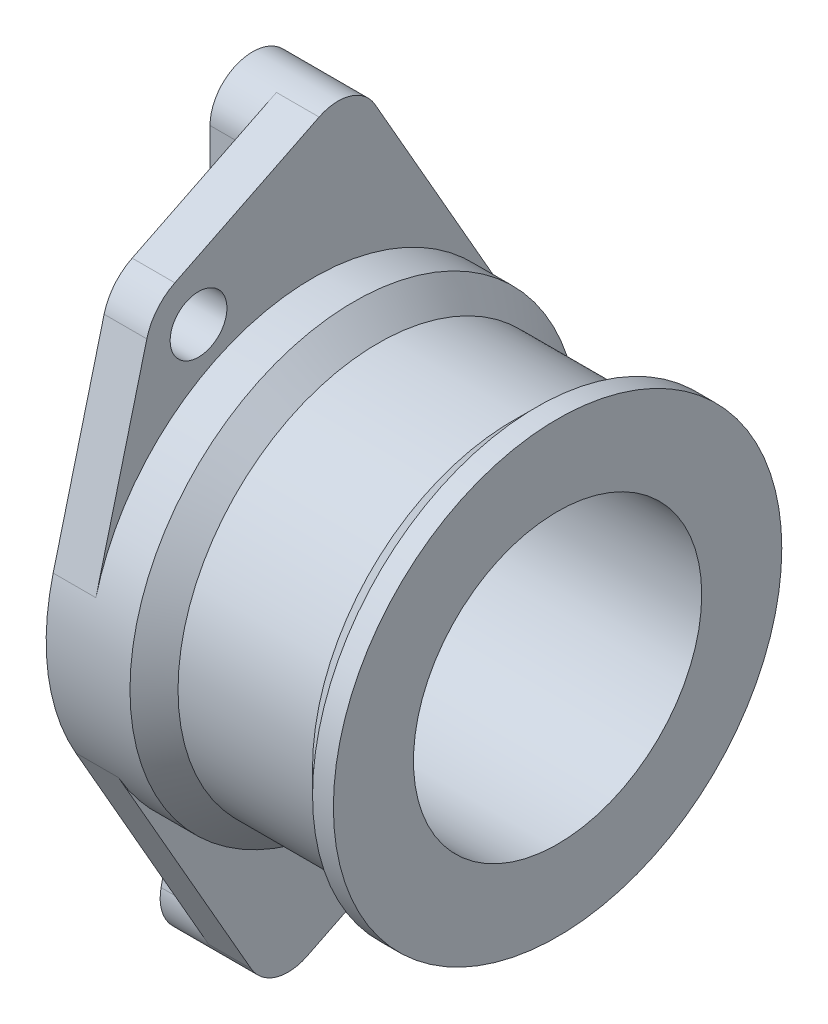
ISO-10303-21;
HEADER;
FILE_DESCRIPTION(('STEP AP214'),'2;1');
FILE_NAME('part.step','',(''),(''),'','','');
FILE_SCHEMA(('AUTOMOTIVE_DESIGN { 1 0 10303 214 1 1 1 1 }'));
ENDSEC;
DATA;
#1=APPLICATION_CONTEXT('core data for automotive mechanical design processes');
#2=APPLICATION_PROTOCOL_DEFINITION('international standard','automotive_design',2000,#1);
#3=PRODUCT_CONTEXT('',#1,'mechanical');
#4=PRODUCT('Part','Part','',(#3));
#5=PRODUCT_RELATED_PRODUCT_CATEGORY('part','',(#4));
#6=PRODUCT_DEFINITION_FORMATION('','',#4);
#7=PRODUCT_DEFINITION_CONTEXT('part definition',#1,'design');
#8=PRODUCT_DEFINITION('design','',#6,#7);
#9=PRODUCT_DEFINITION_SHAPE('','',#8);
#10=(LENGTH_UNIT() NAMED_UNIT(*) SI_UNIT(.MILLI.,.METRE.));
#11=(NAMED_UNIT(*) PLANE_ANGLE_UNIT() SI_UNIT($,.RADIAN.));
#12=(NAMED_UNIT(*) SI_UNIT($,.STERADIAN.) SOLID_ANGLE_UNIT());
#13=UNCERTAINTY_MEASURE_WITH_UNIT(LENGTH_MEASURE(1.E-05),#10,'distance_accuracy_value','');
#14=(GEOMETRIC_REPRESENTATION_CONTEXT(3) GLOBAL_UNCERTAINTY_ASSIGNED_CONTEXT((#13)) GLOBAL_UNIT_ASSIGNED_CONTEXT((#10,
#11,#12)) REPRESENTATION_CONTEXT('',''));
#15=CARTESIAN_POINT('',(0.,0.,0.));
#16=DIRECTION('',(0.,0.,1.));
#17=DIRECTION('',(1.,0.,0.));
#18=AXIS2_PLACEMENT_3D('',#15,#16,#17);
#19=CARTESIAN_POINT('',(-5.08,30.7076011087981,-2.1659998583497));
#20=DIRECTION('',(1.,0.,0.));
#21=DIRECTION('',(0.,0.,-1.));
#22=AXIS2_PLACEMENT_3D('',#19,#20,#21);
#23=CYLINDRICAL_SURFACE('',#22,4.2658017028528);
#24=CARTESIAN_POINT('',(0.,30.7076011087981,-2.1659998583497));
#25=DIRECTION('',(-1.,0.,0.));
#26=DIRECTION('',(0.,0.,-1.));
#27=AXIS2_PLACEMENT_3D('',#24,#25,#26);
#28=CIRCLE('',#27,4.2658017028528);
#29=CARTESIAN_POINT('',(0.,29.8206910640647,-6.33858355920134));
#30=VERTEX_POINT('',#29);
#31=CARTESIAN_POINT('',(0.,26.509400845553,-2.92242481679052));
#32=VERTEX_POINT('',#31);
#33=EDGE_CURVE('E230',#30,#32,#28,.T.);
#34=ORIENTED_EDGE('',*,*,#33,.T.);
#35=DIRECTION('',(-1.,0.,0.));
#36=VECTOR('',#35,1.);
#37=CARTESIAN_POINT('',(0.,26.509400845553,-2.92242481679052));
#38=LINE('',#37,#36);
#39=CARTESIAN_POINT('',(-5.08,26.509400845553,-2.92242481679052));
#40=VERTEX_POINT('',#39);
#41=EDGE_CURVE('E211',#32,#40,#38,.T.);
#42=ORIENTED_EDGE('',*,*,#41,.T.);
#43=CARTESIAN_POINT('',(-5.08,30.7076011087981,-2.1659998583497));
#44=DIRECTION('',(-1.,0.,0.));
#45=DIRECTION('',(0.,0.,-1.));
#46=AXIS2_PLACEMENT_3D('',#43,#44,#45);
#47=CIRCLE('',#46,4.2658017028528);
#48=CARTESIAN_POINT('',(-5.08,29.8206910640646,-6.33858355920149));
#49=VERTEX_POINT('',#48);
#50=EDGE_CURVE('E727',#49,#40,#47,.T.);
#51=ORIENTED_EDGE('',*,*,#50,.F.);
#52=DIRECTION('',(1.,0.,0.));
#53=VECTOR('',#52,1.);
#54=CARTESIAN_POINT('',(-5.08,29.8206910640646,-6.33858355920149));
#55=LINE('',#54,#53);
#56=EDGE_CURVE('E246',#49,#30,#55,.T.);
#57=ORIENTED_EDGE('',*,*,#56,.T.);
#58=EDGE_LOOP('',(#34,#42,#51,#57));
#59=FACE_BOUND('',#58,.T.);
#60=ADVANCED_FACE('F46',(#59),#23,.T.);
#61=CARTESIAN_POINT('',(-5.08,-30.7076011087981,2.1659998583497));
#62=DIRECTION('',(1.,0.,0.));
#63=DIRECTION('',(0.,0.,-1.));
#64=AXIS2_PLACEMENT_3D('',#61,#62,#63);
#65=CYLINDRICAL_SURFACE('',#64,4.2658017028527);
#66=CARTESIAN_POINT('',(0.,-30.7076011087981,2.1659998583497));
#67=DIRECTION('',(-1.,0.,0.));
#68=DIRECTION('',(0.,0.,-1.));
#69=AXIS2_PLACEMENT_3D('',#66,#67,#68);
#70=CIRCLE('',#69,4.2658017028527);
#71=CARTESIAN_POINT('',(0.,-29.8206910640647,6.33858355920129));
#72=VERTEX_POINT('',#71);
#73=CARTESIAN_POINT('',(0.,-26.509400845553,2.92242481679052));
#74=VERTEX_POINT('',#73);
#75=EDGE_CURVE('E273',#72,#74,#70,.T.);
#76=ORIENTED_EDGE('',*,*,#75,.T.);
#77=DIRECTION('',(-1.,0.,0.));
#78=VECTOR('',#77,1.);
#79=CARTESIAN_POINT('',(0.,-26.509400845553,2.92242481679052));
#80=LINE('',#79,#78);
#81=CARTESIAN_POINT('',(-5.08,-26.509400845553,2.92242481679052));
#82=VERTEX_POINT('',#81);
#83=EDGE_CURVE('E708',#74,#82,#80,.T.);
#84=ORIENTED_EDGE('',*,*,#83,.T.);
#85=CARTESIAN_POINT('',(-5.08,-30.7076011087981,2.1659998583497));
#86=DIRECTION('',(-1.,0.,0.));
#87=DIRECTION('',(0.,0.,-1.));
#88=AXIS2_PLACEMENT_3D('',#85,#86,#87);
#89=CIRCLE('',#88,4.2658017028527);
#90=CARTESIAN_POINT('',(-5.08,-29.8206910640647,6.33858355920129));
#91=VERTEX_POINT('',#90);
#92=EDGE_CURVE('E260',#91,#82,#89,.T.);
#93=ORIENTED_EDGE('',*,*,#92,.F.);
#94=DIRECTION('',(1.,0.,0.));
#95=VECTOR('',#94,1.);
#96=CARTESIAN_POINT('',(-5.08,-29.8206910640647,6.33858355920129));
#97=LINE('',#96,#95);
#98=EDGE_CURVE('E283',#91,#72,#97,.T.);
#99=ORIENTED_EDGE('',*,*,#98,.T.);
#100=EDGE_LOOP('',(#76,#84,#93,#99));
#101=FACE_BOUND('',#100,.T.);
#102=ADVANCED_FACE('F706',(#101),#65,.T.);
#103=CARTESIAN_POINT('',(0.,-38.3206980670754,2.96616859215303));
#104=DIRECTION('',(1.,0.,0.));
#105=DIRECTION('',(0.,0.,-1.));
#106=AXIS2_PLACEMENT_3D('',#103,#104,#105);
#107=PLANE('',#106);
#108=CARTESIAN_POINT('',(0.,0.,0.));
#109=DIRECTION('',(1.,0.,0.));
#110=DIRECTION('',(0.,0.,-1.));
#111=AXIS2_PLACEMENT_3D('',#108,#109,#110);
#112=CIRCLE('',#111,17.145);
#113=CARTESIAN_POINT('',(0.,0.,-17.145));
#114=VERTEX_POINT('',#113);
#115=EDGE_CURVE('E565',#114,#114,#112,.T.);
#116=ORIENTED_EDGE('',*,*,#115,.T.);
#117=EDGE_LOOP('',(#116));
#118=FACE_BOUND('',#117,.T.);
#119=CARTESIAN_POINT('',(0.,-28.6781594627474,-13.6244511753454));
#120=DIRECTION('',(-1.,0.,0.));
#121=DIRECTION('',(0.,0.,1.));
#122=AXIS2_PLACEMENT_3D('',#119,#120,#121);
#123=CIRCLE('',#122,3.37819999999999);
#124=CARTESIAN_POINT('',(0.,-28.6781594627474,-10.2462511753454));
#125=VERTEX_POINT('',#124);
#126=EDGE_CURVE('E661',#125,#125,#123,.T.);
#127=ORIENTED_EDGE('',*,*,#126,.F.);
#128=EDGE_LOOP('',(#127));
#129=FACE_BOUND('',#128,.T.);
#130=CARTESIAN_POINT('',(0.,28.6781594627474,13.6244511753454));
#131=DIRECTION('',(-1.,0.,0.));
#132=DIRECTION('',(0.,0.,1.));
#133=AXIS2_PLACEMENT_3D('',#130,#131,#132);
#134=CIRCLE('',#133,3.37819999999999);
#135=CARTESIAN_POINT('',(0.,28.6781594627474,17.0026511753454));
#136=VERTEX_POINT('',#135);
#137=EDGE_CURVE('E1211',#136,#136,#134,.T.);
#138=ORIENTED_EDGE('',*,*,#137,.F.);
#139=EDGE_LOOP('',(#138));
#140=FACE_BOUND('',#139,.T.);
#141=DIRECTION('',(0.,0.968668563940953,-0.248357027749513));
#142=VECTOR('',#141,1.);
#143=CARTESIAN_POINT('',(0.,33.0773129734172,19.0519415525357));
#144=LINE('',#143,#142);
#145=CARTESIAN_POINT('',(0.,6.62368193007954,25.8343906003052));
#146=VERTEX_POINT('',#145);
#147=CARTESIAN_POINT('',(0.,30.2552265889568,19.7754965563705));
#148=VERTEX_POINT('',#147);
#149=EDGE_CURVE('E314',#146,#148,#144,.T.);
#150=ORIENTED_EDGE('',*,*,#149,.T.);
#151=CARTESIAN_POINT('',(0.,28.6781594627474,13.6244511753454));
#152=DIRECTION('',(1.,0.,0.));
#153=DIRECTION('',(0.,0.,-1.));
#154=AXIS2_PLACEMENT_3D('',#151,#152,#153);
#155=CIRCLE('',#154,6.35);
#156=CARTESIAN_POINT('',(0.,34.3694442408475,16.4407923433444));
#157=VERTEX_POINT('',#156);
#158=EDGE_CURVE('E672',#148,#157,#155,.F.);
#159=ORIENTED_EDGE('',*,*,#158,.T.);
#160=DIRECTION('',(0.,0.443518294173067,-0.896265319385846));
#161=VECTOR('',#160,1.);
#162=CARTESIAN_POINT('',(0.,42.8611516784846,-0.719318025755982));
#163=LINE('',#162,#161);
#164=CARTESIAN_POINT('',(0.,42.8611516784845,-0.719318025756039));
#165=VERTEX_POINT('',#164);
#166=EDGE_CURVE('E316',#157,#165,#163,.T.);
#167=ORIENTED_EDGE('',*,*,#166,.T.);
#168=CARTESIAN_POINT('',(0.,38.3206980670754,-2.96616859215303));
#169=DIRECTION('',(-1.,0.,0.));
#170=DIRECTION('',(0.,0.,-1.));
#171=AXIS2_PLACEMENT_3D('',#168,#169,#170);
#172=CIRCLE('',#171,5.0659704366561);
#173=CARTESIAN_POINT('',(0.,38.3206980670755,2.09980184450316));
#174=VERTEX_POINT('',#173);
#175=EDGE_CURVE('E234',#174,#165,#172,.T.);
#176=ORIENTED_EDGE('',*,*,#175,.F.);
#177=DIRECTION('',(0.,1.,0.));
#178=VECTOR('',#177,1.);
#179=CARTESIAN_POINT('',(0.,38.3206980670754,2.09980184450316));
#180=LINE('',#179,#178);
#181=CARTESIAN_POINT('',(0.,30.7076011087981,2.09980184450296));
#182=VERTEX_POINT('',#181);
#183=EDGE_CURVE('E228',#182,#174,#180,.T.);
#184=ORIENTED_EDGE('',*,*,#183,.F.);
#185=CARTESIAN_POINT('',(0.,26.6571517005943,-0.827745861664103));
#186=VERTEX_POINT('',#185);
#187=EDGE_CURVE('E221',#186,#182,#28,.T.);
#188=ORIENTED_EDGE('',*,*,#187,.F.);
#189=CARTESIAN_POINT('',(0.,3.59434704222395E-12,-2.62702186393238E-13));
#190=DIRECTION('',(-1.,0.,0.));
#191=DIRECTION('',(0.,0.,1.));
#192=AXIS2_PLACEMENT_3D('',#189,#190,#191);
#193=CIRCLE('',#192,26.6699999999964);
#194=EDGE_CURVE('E205',#186,#32,#193,.T.);
#195=ORIENTED_EDGE('',*,*,#194,.T.);
#196=ORIENTED_EDGE('',*,*,#33,.F.);
#197=DIRECTION('',(0.,-0.978147600733805,0.20791169081776));
#198=VECTOR('',#197,1.);
#199=CARTESIAN_POINT('',(0.,29.8206910640646,-6.33858355920149));
#200=LINE('',#199,#198);
#201=CARTESIAN_POINT('',(0.,37.2674235879575,-7.92143542015649));
#202=VERTEX_POINT('',#201);
#203=EDGE_CURVE('E231',#202,#30,#200,.T.);
#204=ORIENTED_EDGE('',*,*,#203,.F.);
#205=CARTESIAN_POINT('',(0.,40.8363756208689,-7.36337485413513));
#206=VERTEX_POINT('',#205);
#207=EDGE_CURVE('E721',#206,#202,#172,.T.);
#208=ORIENTED_EDGE('',*,*,#207,.F.);
#209=DIRECTION('',(0.,-0.867988930642967,-0.496583544110433));
#210=VECTOR('',#209,1.);
#211=CARTESIAN_POINT('',(0.,13.2438831214252,-23.149264780248));
#212=LINE('',#211,#210);
#213=CARTESIAN_POINT('',(0.,13.2438831214252,-23.1492647802479));
#214=VERTEX_POINT('',#213);
#215=EDGE_CURVE('E318',#206,#214,#212,.T.);
#216=ORIENTED_EDGE('',*,*,#215,.T.);
#217=CARTESIAN_POINT('',(0.,0.,0.));
#218=DIRECTION('',(-1.,0.,0.));
#219=DIRECTION('',(0.,0.,-1.));
#220=AXIS2_PLACEMENT_3D('',#217,#218,#219);
#221=CIRCLE('',#220,26.67);
#222=CARTESIAN_POINT('',(0.,-6.62368193007954,-25.8343906003052));
#223=VERTEX_POINT('',#222);
#224=EDGE_CURVE('E321',#214,#223,#221,.T.);
#225=ORIENTED_EDGE('',*,*,#224,.T.);
#226=DIRECTION('',(0.,-0.968668563940953,0.248357027749513));
#227=VECTOR('',#226,1.);
#228=CARTESIAN_POINT('',(0.,-33.0773129734172,-19.0519415525357));
#229=LINE('',#228,#227);
#230=CARTESIAN_POINT('',(0.,-30.2552265889568,-19.7754965563705));
#231=VERTEX_POINT('',#230);
#232=EDGE_CURVE('E323',#223,#231,#229,.T.);
#233=ORIENTED_EDGE('',*,*,#232,.T.);
#234=CARTESIAN_POINT('',(0.,-28.6781594627474,-13.6244511753454));
#235=DIRECTION('',(1.,0.,0.));
#236=DIRECTION('',(0.,0.,-1.));
#237=AXIS2_PLACEMENT_3D('',#234,#235,#236);
#238=CIRCLE('',#237,6.35);
#239=CARTESIAN_POINT('',(0.,-34.3694442408475,-16.4407923433444));
#240=VERTEX_POINT('',#239);
#241=EDGE_CURVE('E670',#231,#240,#238,.F.);
#242=ORIENTED_EDGE('',*,*,#241,.T.);
#243=DIRECTION('',(0.,-0.443518294173067,0.896265319385846));
#244=VECTOR('',#243,1.);
#245=CARTESIAN_POINT('',(0.,-42.8611516784846,0.719318025755979));
#246=LINE('',#245,#244);
#247=CARTESIAN_POINT('',(0.,-42.8611516784846,0.719318025755979));
#248=VERTEX_POINT('',#247);
#249=EDGE_CURVE('E326',#240,#248,#246,.T.);
#250=ORIENTED_EDGE('',*,*,#249,.T.);
#251=CARTESIAN_POINT('',(0.,-38.3206980670754,2.96616859215303));
#252=DIRECTION('',(-1.,0.,0.));
#253=DIRECTION('',(0.,0.,-1.));
#254=AXIS2_PLACEMENT_3D('',#251,#252,#253);
#255=CIRCLE('',#254,5.0659704366561);
#256=CARTESIAN_POINT('',(0.,-38.3206980670754,-2.09980184450317));
#257=VERTEX_POINT('',#256);
#258=EDGE_CURVE('E252',#257,#248,#255,.T.);
#259=ORIENTED_EDGE('',*,*,#258,.F.);
#260=DIRECTION('',(0.,-1.,0.));
#261=VECTOR('',#260,1.);
#262=CARTESIAN_POINT('',(0.,-38.3206980670754,-2.09980184450317));
#263=LINE('',#262,#261);
#264=CARTESIAN_POINT('',(0.,-30.7076011087981,-2.09980184450301));
#265=VERTEX_POINT('',#264);
#266=EDGE_CURVE('E257',#265,#257,#263,.T.);
#267=ORIENTED_EDGE('',*,*,#266,.F.);
#268=CARTESIAN_POINT('',(0.,-26.6571517005943,0.827745861664088));
#269=VERTEX_POINT('',#268);
#270=EDGE_CURVE('E272',#269,#265,#70,.T.);
#271=ORIENTED_EDGE('',*,*,#270,.F.);
#272=CARTESIAN_POINT('',(0.,-3.59434704222395E-12,2.62702186393237E-13));
#273=DIRECTION('',(-1.,0.,0.));
#274=DIRECTION('',(0.,0.,1.));
#275=AXIS2_PLACEMENT_3D('',#272,#273,#274);
#276=CIRCLE('',#275,26.6699999999964);
#277=EDGE_CURVE('E700',#269,#74,#276,.T.);
#278=ORIENTED_EDGE('',*,*,#277,.T.);
#279=ORIENTED_EDGE('',*,*,#75,.F.);
#280=DIRECTION('',(0.,0.9781476007338,-0.207911690817785));
#281=VECTOR('',#280,1.);
#282=CARTESIAN_POINT('',(0.,-29.8206910640647,6.33858355920129));
#283=LINE('',#282,#281);
#284=CARTESIAN_POINT('',(0.,-37.2674235879575,7.92143542015648));
#285=VERTEX_POINT('',#284);
#286=EDGE_CURVE('E268',#285,#72,#283,.T.);
#287=ORIENTED_EDGE('',*,*,#286,.F.);
#288=CARTESIAN_POINT('',(0.,-40.8363756208688,7.36337485413513));
#289=VERTEX_POINT('',#288);
#290=EDGE_CURVE('E269',#289,#285,#255,.T.);
#291=ORIENTED_EDGE('',*,*,#290,.F.);
#292=DIRECTION('',(0.,0.867988930642967,0.496583544110433));
#293=VECTOR('',#292,1.);
#294=CARTESIAN_POINT('',(0.,-13.2438831214252,23.149264780248));
#295=LINE('',#294,#293);
#296=CARTESIAN_POINT('',(0.,-13.2438831214252,23.149264780248));
#297=VERTEX_POINT('',#296);
#298=EDGE_CURVE('E308',#289,#297,#295,.T.);
#299=ORIENTED_EDGE('',*,*,#298,.T.);
#300=CARTESIAN_POINT('',(0.,0.,0.));
#301=DIRECTION('',(-1.,0.,0.));
#302=DIRECTION('',(0.,0.,-1.));
#303=AXIS2_PLACEMENT_3D('',#300,#301,#302);
#304=CIRCLE('',#303,26.67);
#305=EDGE_CURVE('E310',#297,#146,#304,.T.);
#306=ORIENTED_EDGE('',*,*,#305,.T.);
#307=EDGE_LOOP('',(#150,#159,#167,#176,#184,#188,#195,#196,#204,#208,#216,#225,#233,#242,#250,
#259,#267,#271,#278,#279,#287,#291,#299,#306));
#308=FACE_BOUND('',#307,.T.);
#309=ADVANCED_FACE('F226',(#118,#129,#140,#308),#107,.F.);
#310=CARTESIAN_POINT('',(31.6855,0.,0.));
#311=DIRECTION('',(1.,0.,0.));
#312=DIRECTION('',(0.,0.,-1.));
#313=AXIS2_PLACEMENT_3D('',#310,#311,#312);
#314=CONICAL_SURFACE('',#313,26.67,0.785398163397448);
#315=CARTESIAN_POINT('',(28.828,0.,0.));
#316=DIRECTION('',(-1.,0.,0.));
#317=DIRECTION('',(0.,0.,1.));
#318=AXIS2_PLACEMENT_3D('',#315,#316,#317);
#319=CIRCLE('',#318,23.8125);
#320=CARTESIAN_POINT('',(28.828,0.,23.8125));
#321=VERTEX_POINT('',#320);
#322=EDGE_CURVE('E560',#321,#321,#319,.T.);
#323=ORIENTED_EDGE('',*,*,#322,.F.);
#324=EDGE_LOOP('',(#323));
#325=FACE_BOUND('',#324,.T.);
#326=CARTESIAN_POINT('',(31.6855,0.,0.));
#327=DIRECTION('',(1.,0.,0.));
#328=DIRECTION('',(0.,0.,-1.));
#329=AXIS2_PLACEMENT_3D('',#326,#327,#328);
#330=CIRCLE('',#329,26.67);
#331=CARTESIAN_POINT('',(31.6855,0.,-26.67));
#332=VERTEX_POINT('',#331);
#333=EDGE_CURVE('E289',#332,#332,#330,.T.);
#334=ORIENTED_EDGE('',*,*,#333,.F.);
#335=EDGE_LOOP('',(#334));
#336=FACE_BOUND('',#335,.T.);
#337=ADVANCED_FACE('F789',(#325,#336),#314,.T.);
#338=CARTESIAN_POINT('',(25.4,0.,0.));
#339=DIRECTION('',(-1.,0.,0.));
#340=DIRECTION('',(0.,0.,1.));
#341=AXIS2_PLACEMENT_3D('',#338,#339,#340);
#342=CYLINDRICAL_SURFACE('',#341,23.8125);
#343=CARTESIAN_POINT('',(12.828,0.,0.));
#344=DIRECTION('',(-1.,0.,0.));
#345=DIRECTION('',(0.,0.,1.));
#346=AXIS2_PLACEMENT_3D('',#343,#344,#345);
#347=CIRCLE('',#346,23.8125);
#348=CARTESIAN_POINT('',(12.828,0.,23.8125));
#349=VERTEX_POINT('',#348);
#350=EDGE_CURVE('E367',#349,#349,#347,.T.);
#351=ORIENTED_EDGE('',*,*,#350,.F.);
#352=EDGE_LOOP('',(#351));
#353=FACE_BOUND('',#352,.T.);
#354=ORIENTED_EDGE('',*,*,#322,.T.);
#355=EDGE_LOOP('',(#354));
#356=FACE_BOUND('',#355,.T.);
#357=ADVANCED_FACE('F827',(#353,#356),#342,.T.);
#358=CARTESIAN_POINT('',(12.828,0.,0.));
#359=DIRECTION('',(-1.,0.,0.));
#360=DIRECTION('',(0.,0.,1.));
#361=AXIS2_PLACEMENT_3D('',#358,#359,#360);
#362=CONICAL_SURFACE('',#361,23.8125,0.785398163397448);
#363=CARTESIAN_POINT('',(9.9705,0.,0.));
#364=DIRECTION('',(-1.,0.,0.));
#365=DIRECTION('',(0.,0.,1.));
#366=AXIS2_PLACEMENT_3D('',#363,#364,#365);
#367=CIRCLE('',#366,26.67);
#368=CARTESIAN_POINT('',(9.9705,0.,26.67));
#369=VERTEX_POINT('',#368);
#370=EDGE_CURVE('E362',#369,#369,#367,.T.);
#371=ORIENTED_EDGE('',*,*,#370,.F.);
#372=EDGE_LOOP('',(#371));
#373=FACE_BOUND('',#372,.T.);
#374=ORIENTED_EDGE('',*,*,#350,.T.);
#375=EDGE_LOOP('',(#374));
#376=FACE_BOUND('',#375,.T.);
#377=ADVANCED_FACE('F823',(#373,#376),#362,.T.);
#378=CARTESIAN_POINT('',(5.08,0.,0.));
#379=DIRECTION('',(1.,0.,0.));
#380=DIRECTION('',(0.,0.,-1.));
#381=AXIS2_PLACEMENT_3D('',#378,#379,#380);
#382=CYLINDRICAL_SURFACE('',#381,26.67);
#383=ORIENTED_EDGE('',*,*,#370,.T.);
#384=EDGE_LOOP('',(#383));
#385=FACE_BOUND('',#384,.T.);
#386=CARTESIAN_POINT('',(5.08,0.,0.));
#387=DIRECTION('',(-1.,0.,0.));
#388=DIRECTION('',(0.,0.,1.));
#389=AXIS2_PLACEMENT_3D('',#386,#387,#388);
#390=CIRCLE('',#389,26.67);
#391=CARTESIAN_POINT('',(5.08,6.62368193007953,25.8343906003052));
#392=VERTEX_POINT('',#391);
#393=CARTESIAN_POINT('',(5.08,13.2438831214252,-23.149264780248));
#394=VERTEX_POINT('',#393);
#395=EDGE_CURVE('E293',#392,#394,#390,.T.);
#396=ORIENTED_EDGE('',*,*,#395,.F.);
#397=DIRECTION('',(1.,0.,0.));
#398=VECTOR('',#397,1.);
#399=CARTESIAN_POINT('',(5.08,6.62368193007953,25.8343906003052));
#400=LINE('',#399,#398);
#401=EDGE_CURVE('E359',#146,#392,#400,.T.);
#402=ORIENTED_EDGE('',*,*,#401,.F.);
#403=ORIENTED_EDGE('',*,*,#305,.F.);
#404=DIRECTION('',(1.,0.,0.));
#405=VECTOR('',#404,1.);
#406=CARTESIAN_POINT('',(0.,-13.2438831214252,23.149264780248));
#407=LINE('',#406,#405);
#408=CARTESIAN_POINT('',(5.08,-13.2438831214253,23.1492647802479));
#409=VERTEX_POINT('',#408);
#410=EDGE_CURVE('E342',#297,#409,#407,.T.);
#411=ORIENTED_EDGE('',*,*,#410,.T.);
#412=CARTESIAN_POINT('',(5.08,0.,0.));
#413=DIRECTION('',(-1.,0.,0.));
#414=DIRECTION('',(0.,0.,-1.));
#415=AXIS2_PLACEMENT_3D('',#412,#413,#414);
#416=CIRCLE('',#415,26.67);
#417=CARTESIAN_POINT('',(5.08,-6.62368193007951,-25.8343906003052));
#418=VERTEX_POINT('',#417);
#419=EDGE_CURVE('E348',#418,#409,#416,.T.);
#420=ORIENTED_EDGE('',*,*,#419,.F.);
#421=DIRECTION('',(1.,0.,0.));
#422=VECTOR('',#421,1.);
#423=CARTESIAN_POINT('',(0.,-6.62368193007954,-25.8343906003052));
#424=LINE('',#423,#422);
#425=EDGE_CURVE('E339',#223,#418,#424,.T.);
#426=ORIENTED_EDGE('',*,*,#425,.F.);
#427=ORIENTED_EDGE('',*,*,#224,.F.);
#428=DIRECTION('',(1.,0.,0.));
#429=VECTOR('',#428,1.);
#430=CARTESIAN_POINT('',(5.08,13.2438831214252,-23.149264780248));
#431=LINE('',#430,#429);
#432=EDGE_CURVE('E350',#214,#394,#431,.T.);
#433=ORIENTED_EDGE('',*,*,#432,.T.);
#434=EDGE_LOOP('',(#396,#402,#403,#411,#420,#426,#427,#433));
#435=FACE_BOUND('',#434,.T.);
#436=ADVANCED_FACE('F819',(#385,#435),#382,.T.);
#437=CARTESIAN_POINT('',(5.08,33.0773129734172,19.0519415525357));
#438=DIRECTION('',(0.,-0.248357027749513,-0.968668563940953));
#439=DIRECTION('',(0.,0.968668563940953,-0.248357027749513));
#440=AXIS2_PLACEMENT_3D('',#437,#438,#439);
#441=PLANE('',#440);
#442=DIRECTION('',(0.,-0.968668563940953,0.248357027749513));
#443=VECTOR('',#442,1.);
#444=CARTESIAN_POINT('',(5.08,33.0773129734172,19.0519415525357));
#445=LINE('',#444,#443);
#446=CARTESIAN_POINT('',(5.08,30.2552265889568,19.7754965563705));
#447=VERTEX_POINT('',#446);
#448=EDGE_CURVE('E305',#447,#392,#445,.T.);
#449=ORIENTED_EDGE('',*,*,#448,.F.);
#450=DIRECTION('',(1.,0.,0.));
#451=VECTOR('',#450,1.);
#452=CARTESIAN_POINT('',(5.08,30.2552265889568,19.7754965563705));
#453=LINE('',#452,#451);
#454=EDGE_CURVE('E668',#447,#148,#453,.F.);
#455=ORIENTED_EDGE('',*,*,#454,.T.);
#456=ORIENTED_EDGE('',*,*,#149,.F.);
#457=ORIENTED_EDGE('',*,*,#401,.T.);
#458=EDGE_LOOP('',(#449,#455,#456,#457));
#459=FACE_BOUND('',#458,.T.);
#460=ADVANCED_FACE('F815',(#459),#441,.F.);
#461=CARTESIAN_POINT('',(5.08,42.8611516784846,-0.719318025755982));
#462=DIRECTION('',(0.,-0.896265319385846,-0.443518294173067));
#463=DIRECTION('',(0.,0.443518294173067,-0.896265319385846));
#464=AXIS2_PLACEMENT_3D('',#461,#462,#463);
#465=PLANE('',#464);
#466=ORIENTED_EDGE('',*,*,#166,.F.);
#467=DIRECTION('',(1.,0.,0.));
#468=VECTOR('',#467,1.);
#469=CARTESIAN_POINT('',(5.08,34.3694442408475,16.4407923433444));
#470=LINE('',#469,#468);
#471=CARTESIAN_POINT('',(5.08,34.3694442408475,16.4407923433444));
#472=VERTEX_POINT('',#471);
#473=EDGE_CURVE('E663',#157,#472,#470,.T.);
#474=ORIENTED_EDGE('',*,*,#473,.T.);
#475=DIRECTION('',(0.,-0.443518294173066,0.896265319385847));
#476=VECTOR('',#475,1.);
#477=CARTESIAN_POINT('',(5.08,42.8611516784846,-0.719318025755978));
#478=LINE('',#477,#476);
#479=CARTESIAN_POINT('',(5.08,42.8611516784846,-0.719318025755978));
#480=VERTEX_POINT('',#479);
#481=EDGE_CURVE('E302',#480,#472,#478,.T.);
#482=ORIENTED_EDGE('',*,*,#481,.F.);
#483=DIRECTION('',(1.,0.,0.));
#484=VECTOR('',#483,1.);
#485=CARTESIAN_POINT('',(5.08,42.8611516784846,-0.719318025755982));
#486=LINE('',#485,#484);
#487=EDGE_CURVE('E356',#165,#480,#486,.T.);
#488=ORIENTED_EDGE('',*,*,#487,.F.);
#489=EDGE_LOOP('',(#466,#474,#482,#488));
#490=FACE_BOUND('',#489,.T.);
#491=ADVANCED_FACE('F812',(#490),#465,.F.);
#492=CARTESIAN_POINT('',(5.08,38.3206980670754,-2.96616859215303));
#493=DIRECTION('',(1.,0.,0.));
#494=DIRECTION('',(0.,0.,-1.));
#495=AXIS2_PLACEMENT_3D('',#492,#493,#494);
#496=CYLINDRICAL_SURFACE('',#495,5.06597043665631);
#497=ORIENTED_EDGE('',*,*,#487,.T.);
#498=CARTESIAN_POINT('',(5.08,38.3206980670754,-2.96616859215303));
#499=DIRECTION('',(1.,0.,0.));
#500=DIRECTION('',(0.,0.,-1.));
#501=AXIS2_PLACEMENT_3D('',#498,#499,#500);
#502=CIRCLE('',#501,5.0659704366563);
#503=CARTESIAN_POINT('',(5.08,40.8363756208689,-7.36337485413523));
#504=VERTEX_POINT('',#503);
#505=EDGE_CURVE('E300',#504,#480,#502,.T.);
#506=ORIENTED_EDGE('',*,*,#505,.F.);
#507=DIRECTION('',(1.,0.,0.));
#508=VECTOR('',#507,1.);
#509=CARTESIAN_POINT('',(5.08,40.8363756208689,-7.36337485413524));
#510=LINE('',#509,#508);
#511=EDGE_CURVE('E353',#206,#504,#510,.T.);
#512=ORIENTED_EDGE('',*,*,#511,.F.);
#513=ORIENTED_EDGE('',*,*,#207,.T.);
#514=DIRECTION('',(1.,0.,0.));
#515=VECTOR('',#514,1.);
#516=CARTESIAN_POINT('',(-5.08,37.2674235879575,-7.92143542015649));
#517=LINE('',#516,#515);
#518=CARTESIAN_POINT('',(-5.08,37.2674235879575,-7.92143542015649));
#519=VERTEX_POINT('',#518);
#520=EDGE_CURVE('E249',#519,#202,#517,.T.);
#521=ORIENTED_EDGE('',*,*,#520,.F.);
#522=CARTESIAN_POINT('',(-5.08,38.3206980670754,-2.96616859215303));
#523=DIRECTION('',(-1.,0.,0.));
#524=DIRECTION('',(0.,0.,-1.));
#525=AXIS2_PLACEMENT_3D('',#522,#523,#524);
#526=CIRCLE('',#525,5.0659704366561);
#527=CARTESIAN_POINT('',(-5.08,38.3206980670754,2.09980184450316));
#528=VERTEX_POINT('',#527);
#529=EDGE_CURVE('E239',#528,#519,#526,.T.);
#530=ORIENTED_EDGE('',*,*,#529,.F.);
#531=DIRECTION('',(1.,0.,0.));
#532=VECTOR('',#531,1.);
#533=CARTESIAN_POINT('',(-5.08,38.3206980670754,2.09980184450316));
#534=LINE('',#533,#532);
#535=EDGE_CURVE('E240',#528,#174,#534,.T.);
#536=ORIENTED_EDGE('',*,*,#535,.T.);
#537=ORIENTED_EDGE('',*,*,#175,.T.);
#538=EDGE_LOOP('',(#497,#506,#512,#513,#521,#530,#536,#537));
#539=FACE_BOUND('',#538,.T.);
#540=ADVANCED_FACE('F736',(#539),#496,.T.);
#541=CARTESIAN_POINT('',(5.08,13.2438831214252,-23.149264780248));
#542=DIRECTION('',(0.,-0.496583544110433,0.867988930642967));
#543=DIRECTION('',(0.,-0.867988930642967,-0.496583544110433));
#544=AXIS2_PLACEMENT_3D('',#541,#542,#543);
#545=PLANE('',#544);
#546=ORIENTED_EDGE('',*,*,#511,.T.);
#547=DIRECTION('',(0.,0.867988930642967,0.496583544110433));
#548=VECTOR('',#547,1.);
#549=CARTESIAN_POINT('',(5.08,13.2438831214252,-23.149264780248));
#550=LINE('',#549,#548);
#551=EDGE_CURVE('E298',#394,#504,#550,.T.);
#552=ORIENTED_EDGE('',*,*,#551,.F.);
#553=ORIENTED_EDGE('',*,*,#432,.F.);
#554=ORIENTED_EDGE('',*,*,#215,.F.);
#555=EDGE_LOOP('',(#546,#552,#553,#554));
#556=FACE_BOUND('',#555,.T.);
#557=ADVANCED_FACE('F806',(#556),#545,.F.);
#558=CARTESIAN_POINT('',(0.,-38.3206980670754,2.96616859215303));
#559=DIRECTION('',(1.,0.,0.));
#560=DIRECTION('',(0.,0.,-1.));
#561=AXIS2_PLACEMENT_3D('',#558,#559,#560);
#562=CYLINDRICAL_SURFACE('',#561,5.06597043665631);
#563=CARTESIAN_POINT('',(5.08,-38.3206980670754,2.96616859215303));
#564=DIRECTION('',(-1.,0.,0.));
#565=DIRECTION('',(0.,0.,-1.));
#566=AXIS2_PLACEMENT_3D('',#563,#564,#565);
#567=CIRCLE('',#566,5.06597043665631);
#568=CARTESIAN_POINT('',(5.08,-42.8611516784846,0.719318025755979));
#569=VERTEX_POINT('',#568);
#570=CARTESIAN_POINT('',(5.08,-40.8363756208688,7.36337485413513));
#571=VERTEX_POINT('',#570);
#572=EDGE_CURVE('E307',#569,#571,#567,.T.);
#573=ORIENTED_EDGE('',*,*,#572,.T.);
#574=DIRECTION('',(1.,0.,0.));
#575=VECTOR('',#574,1.);
#576=CARTESIAN_POINT('',(0.,-40.8363756208688,7.36337485413513));
#577=LINE('',#576,#575);
#578=EDGE_CURVE('E345',#289,#571,#577,.T.);
#579=ORIENTED_EDGE('',*,*,#578,.F.);
#580=ORIENTED_EDGE('',*,*,#290,.T.);
#581=DIRECTION('',(1.,0.,0.));
#582=VECTOR('',#581,1.);
#583=CARTESIAN_POINT('',(-5.08,-37.2674235879575,7.92143542015648));
#584=LINE('',#583,#582);
#585=CARTESIAN_POINT('',(-5.08,-37.2674235879575,7.92143542015648));
#586=VERTEX_POINT('',#585);
#587=EDGE_CURVE('E286',#586,#285,#584,.T.);
#588=ORIENTED_EDGE('',*,*,#587,.F.);
#589=CARTESIAN_POINT('',(-5.08,-38.3206980670754,2.96616859215303));
#590=DIRECTION('',(-1.,0.,0.));
#591=DIRECTION('',(0.,0.,-1.));
#592=AXIS2_PLACEMENT_3D('',#589,#590,#591);
#593=CIRCLE('',#592,5.0659704366561);
#594=CARTESIAN_POINT('',(-5.08,-38.3206980670754,-2.09980184450317));
#595=VERTEX_POINT('',#594);
#596=EDGE_CURVE('E253',#595,#586,#593,.T.);
#597=ORIENTED_EDGE('',*,*,#596,.F.);
#598=DIRECTION('',(1.,0.,0.));
#599=VECTOR('',#598,1.);
#600=CARTESIAN_POINT('',(-5.08,-38.3206980670754,-2.09980184450317));
#601=LINE('',#600,#599);
#602=EDGE_CURVE('E265',#595,#257,#601,.T.);
#603=ORIENTED_EDGE('',*,*,#602,.T.);
#604=ORIENTED_EDGE('',*,*,#258,.T.);
#605=DIRECTION('',(1.,0.,0.));
#606=VECTOR('',#605,1.);
#607=CARTESIAN_POINT('',(0.,-42.8611516784846,0.719318025755979));
#608=LINE('',#607,#606);
#609=EDGE_CURVE('E328',#248,#569,#608,.T.);
#610=ORIENTED_EDGE('',*,*,#609,.T.);
#611=EDGE_LOOP('',(#573,#579,#580,#588,#597,#603,#604,#610));
#612=FACE_BOUND('',#611,.T.);
#613=ADVANCED_FACE('F684',(#612),#562,.T.);
#614=CARTESIAN_POINT('',(0.,-13.2438831214252,23.149264780248));
#615=DIRECTION('',(0.,0.496583544110433,-0.867988930642967));
#616=DIRECTION('',(0.,0.867988930642967,0.496583544110433));
#617=AXIS2_PLACEMENT_3D('',#614,#615,#616);
#618=PLANE('',#617);
#619=DIRECTION('',(0.,0.867988930642967,0.496583544110433));
#620=VECTOR('',#619,1.);
#621=CARTESIAN_POINT('',(5.08,-13.2438831214252,23.149264780248));
#622=LINE('',#621,#620);
#623=EDGE_CURVE('E331',#571,#409,#622,.T.);
#624=ORIENTED_EDGE('',*,*,#623,.T.);
#625=ORIENTED_EDGE('',*,*,#410,.F.);
#626=ORIENTED_EDGE('',*,*,#298,.F.);
#627=ORIENTED_EDGE('',*,*,#578,.T.);
#628=EDGE_LOOP('',(#624,#625,#626,#627));
#629=FACE_BOUND('',#628,.T.);
#630=ADVANCED_FACE('F799',(#629),#618,.F.);
#631=CARTESIAN_POINT('',(0.,-33.0773129734172,-19.0519415525357));
#632=DIRECTION('',(0.,0.248357027749513,0.968668563940953));
#633=DIRECTION('',(0.,-0.968668563940953,0.248357027749513));
#634=AXIS2_PLACEMENT_3D('',#631,#632,#633);
#635=PLANE('',#634);
#636=DIRECTION('',(0.,-0.968668563940953,0.248357027749513));
#637=VECTOR('',#636,1.);
#638=CARTESIAN_POINT('',(5.08,-33.0773129734172,-19.0519415525357));
#639=LINE('',#638,#637);
#640=CARTESIAN_POINT('',(5.08,-30.2552265889568,-19.7754965563705));
#641=VERTEX_POINT('',#640);
#642=EDGE_CURVE('E334',#418,#641,#639,.T.);
#643=ORIENTED_EDGE('',*,*,#642,.T.);
#644=DIRECTION('',(1.,0.,0.));
#645=VECTOR('',#644,1.);
#646=CARTESIAN_POINT('',(0.,-30.2552265889568,-19.7754965563705));
#647=LINE('',#646,#645);
#648=EDGE_CURVE('E12',#641,#231,#647,.F.);
#649=ORIENTED_EDGE('',*,*,#648,.T.);
#650=ORIENTED_EDGE('',*,*,#232,.F.);
#651=ORIENTED_EDGE('',*,*,#425,.T.);
#652=EDGE_LOOP('',(#643,#649,#650,#651));
#653=FACE_BOUND('',#652,.T.);
#654=ADVANCED_FACE('F796',(#653),#635,.F.);
#655=CARTESIAN_POINT('',(0.,-42.8611516784846,0.719318025755979));
#656=DIRECTION('',(0.,0.896265319385846,0.443518294173067));
#657=DIRECTION('',(0.,-0.443518294173067,0.896265319385846));
#658=AXIS2_PLACEMENT_3D('',#655,#656,#657);
#659=PLANE('',#658);
#660=ORIENTED_EDGE('',*,*,#249,.F.);
#661=DIRECTION('',(1.,0.,0.));
#662=VECTOR('',#661,1.);
#663=CARTESIAN_POINT('',(0.,-34.3694442408475,-16.4407923433444));
#664=LINE('',#663,#662);
#665=CARTESIAN_POINT('',(5.08,-34.3694442408475,-16.4407923433444));
#666=VERTEX_POINT('',#665);
#667=EDGE_CURVE('E674',#240,#666,#664,.T.);
#668=ORIENTED_EDGE('',*,*,#667,.T.);
#669=DIRECTION('',(0.,-0.443518294173067,0.896265319385846));
#670=VECTOR('',#669,1.);
#671=CARTESIAN_POINT('',(5.08,-42.8611516784846,0.719318025755979));
#672=LINE('',#671,#670);
#673=EDGE_CURVE('E311',#666,#569,#672,.T.);
#674=ORIENTED_EDGE('',*,*,#673,.T.);
#675=ORIENTED_EDGE('',*,*,#609,.F.);
#676=EDGE_LOOP('',(#660,#668,#674,#675));
#677=FACE_BOUND('',#676,.T.);
#678=ADVANCED_FACE('F677',(#677),#659,.F.);
#679=CARTESIAN_POINT('',(5.08,-38.3206980670754,2.96616859215303));
#680=DIRECTION('',(1.,0.,0.));
#681=DIRECTION('',(0.,0.,-1.));
#682=AXIS2_PLACEMENT_3D('',#679,#680,#681);
#683=PLANE('',#682);
#684=CARTESIAN_POINT('',(5.08,-28.6781594627474,-13.6244511753454));
#685=DIRECTION('',(1.,0.,0.));
#686=DIRECTION('',(0.,0.,-1.));
#687=AXIS2_PLACEMENT_3D('',#684,#685,#686);
#688=CIRCLE('',#687,3.37819999999999);
#689=CARTESIAN_POINT('',(5.08,-28.6781594627474,-17.0026511753454));
#690=VERTEX_POINT('',#689);
#691=EDGE_CURVE('E1217',#690,#690,#688,.T.);
#692=ORIENTED_EDGE('',*,*,#691,.F.);
#693=EDGE_LOOP('',(#692));
#694=FACE_BOUND('',#693,.T.);
#695=ORIENTED_EDGE('',*,*,#673,.F.);
#696=CARTESIAN_POINT('',(5.08,-28.6781594627474,-13.6244511753454));
#697=DIRECTION('',(1.,0.,0.));
#698=DIRECTION('',(0.,0.,-1.));
#699=AXIS2_PLACEMENT_3D('',#696,#697,#698);
#700=CIRCLE('',#699,6.35);
#701=EDGE_CURVE('E54',#666,#641,#700,.T.);
#702=ORIENTED_EDGE('',*,*,#701,.T.);
#703=ORIENTED_EDGE('',*,*,#642,.F.);
#704=ORIENTED_EDGE('',*,*,#419,.T.);
#705=ORIENTED_EDGE('',*,*,#623,.F.);
#706=ORIENTED_EDGE('',*,*,#572,.F.);
#707=EDGE_LOOP('',(#695,#702,#703,#704,#705,#706));
#708=FACE_BOUND('',#707,.T.);
#709=ADVANCED_FACE('F681',(#694,#708),#683,.T.);
#710=CARTESIAN_POINT('',(5.08,0.,0.));
#711=DIRECTION('',(-1.,0.,0.));
#712=DIRECTION('',(0.,0.,1.));
#713=AXIS2_PLACEMENT_3D('',#710,#711,#712);
#714=PLANE('',#713);
#715=CARTESIAN_POINT('',(5.08,28.6781594627474,13.6244511753454));
#716=DIRECTION('',(-1.,0.,0.));
#717=DIRECTION('',(0.,0.,1.));
#718=AXIS2_PLACEMENT_3D('',#715,#716,#717);
#719=CIRCLE('',#718,3.37819999999999);
#720=CARTESIAN_POINT('',(5.08,28.6781594627474,17.0026511753454));
#721=VERTEX_POINT('',#720);
#722=EDGE_CURVE('E1214',#721,#721,#719,.T.);
#723=ORIENTED_EDGE('',*,*,#722,.T.);
#724=EDGE_LOOP('',(#723));
#725=FACE_BOUND('',#724,.T.);
#726=ORIENTED_EDGE('',*,*,#481,.T.);
#727=CARTESIAN_POINT('',(5.08,28.6781594627474,13.6244511753454));
#728=DIRECTION('',(-1.,0.,0.));
#729=DIRECTION('',(0.,0.,1.));
#730=AXIS2_PLACEMENT_3D('',#727,#728,#729);
#731=CIRCLE('',#730,6.35);
#732=EDGE_CURVE('E666',#472,#447,#731,.F.);
#733=ORIENTED_EDGE('',*,*,#732,.T.);
#734=ORIENTED_EDGE('',*,*,#448,.T.);
#735=ORIENTED_EDGE('',*,*,#395,.T.);
#736=ORIENTED_EDGE('',*,*,#551,.T.);
#737=ORIENTED_EDGE('',*,*,#505,.T.);
#738=EDGE_LOOP('',(#726,#733,#734,#735,#736,#737));
#739=FACE_BOUND('',#738,.T.);
#740=ADVANCED_FACE('F782',(#725,#739),#714,.F.);
#741=CARTESIAN_POINT('',(34.163,0.,0.));
#742=DIRECTION('',(-1.,0.,0.));
#743=DIRECTION('',(0.,0.,1.));
#744=AXIS2_PLACEMENT_3D('',#741,#742,#743);
#745=CYLINDRICAL_SURFACE('',#744,26.67);
#746=CARTESIAN_POINT('',(34.163,0.,0.));
#747=DIRECTION('',(1.,0.,0.));
#748=DIRECTION('',(0.,0.,-1.));
#749=AXIS2_PLACEMENT_3D('',#746,#747,#748);
#750=CIRCLE('',#749,26.67);
#751=CARTESIAN_POINT('',(34.163,0.,-26.67));
#752=VERTEX_POINT('',#751);
#753=EDGE_CURVE('E290',#752,#752,#750,.T.);
#754=ORIENTED_EDGE('',*,*,#753,.F.);
#755=EDGE_LOOP('',(#754));
#756=FACE_BOUND('',#755,.T.);
#757=ORIENTED_EDGE('',*,*,#333,.T.);
#758=EDGE_LOOP('',(#757));
#759=FACE_BOUND('',#758,.T.);
#760=ADVANCED_FACE('F778',(#756,#759),#745,.T.);
#761=CARTESIAN_POINT('',(34.163,0.,0.));
#762=DIRECTION('',(1.,0.,0.));
#763=DIRECTION('',(0.,0.,-1.));
#764=AXIS2_PLACEMENT_3D('',#761,#762,#763);
#765=PLANE('',#764);
#766=CARTESIAN_POINT('',(34.163,0.,0.));
#767=DIRECTION('',(1.,0.,0.));
#768=DIRECTION('',(0.,0.,-1.));
#769=AXIS2_PLACEMENT_3D('',#766,#767,#768);
#770=CIRCLE('',#769,17.145);
#771=CARTESIAN_POINT('',(34.163,0.,-17.145));
#772=VERTEX_POINT('',#771);
#773=EDGE_CURVE('E662',#772,#772,#770,.T.);
#774=ORIENTED_EDGE('',*,*,#773,.F.);
#775=EDGE_LOOP('',(#774));
#776=FACE_BOUND('',#775,.T.);
#777=ORIENTED_EDGE('',*,*,#753,.T.);
#778=EDGE_LOOP('',(#777));
#779=FACE_BOUND('',#778,.T.);
#780=ADVANCED_FACE('F775',(#776,#779),#765,.T.);
#781=CARTESIAN_POINT('',(-5.08,-29.8206910640647,6.33858355920129));
#782=DIRECTION('',(0.,-0.207911690817785,-0.9781476007338));
#783=DIRECTION('',(0.,0.9781476007338,-0.207911690817785));
#784=AXIS2_PLACEMENT_3D('',#781,#782,#783);
#785=PLANE('',#784);
#786=ORIENTED_EDGE('',*,*,#286,.T.);
#787=ORIENTED_EDGE('',*,*,#98,.F.);
#788=DIRECTION('',(0.,0.9781476007338,-0.207911690817785));
#789=VECTOR('',#788,1.);
#790=CARTESIAN_POINT('',(-5.08,-29.8206910640647,6.33858355920129));
#791=LINE('',#790,#789);
#792=EDGE_CURVE('E256',#586,#91,#791,.T.);
#793=ORIENTED_EDGE('',*,*,#792,.F.);
#794=ORIENTED_EDGE('',*,*,#587,.T.);
#795=EDGE_LOOP('',(#786,#787,#793,#794));
#796=FACE_BOUND('',#795,.T.);
#797=ADVANCED_FACE('F711',(#796),#785,.F.);
#798=CARTESIAN_POINT('',(-5.08,-26.6571517005943,0.827745861665081));
#799=VERTEX_POINT('',#798);
#800=CARTESIAN_POINT('',(-5.08,-30.7076011087981,-2.09980184450301));
#801=VERTEX_POINT('',#800);
#802=EDGE_CURVE('E259',#799,#801,#89,.T.);
#803=ORIENTED_EDGE('',*,*,#802,.F.);
#804=DIRECTION('',(-1.,0.,0.));
#805=VECTOR('',#804,1.);
#806=CARTESIAN_POINT('',(0.,-26.6571517005943,0.827745861664088));
#807=LINE('',#806,#805);
#808=EDGE_CURVE('E698',#269,#799,#807,.T.);
#809=ORIENTED_EDGE('',*,*,#808,.F.);
#810=ORIENTED_EDGE('',*,*,#270,.T.);
#811=DIRECTION('',(1.,0.,0.));
#812=VECTOR('',#811,1.);
#813=CARTESIAN_POINT('',(-5.08,-30.7076011087981,-2.09980184450301));
#814=LINE('',#813,#812);
#815=EDGE_CURVE('E280',#801,#265,#814,.T.);
#816=ORIENTED_EDGE('',*,*,#815,.F.);
#817=EDGE_LOOP('',(#803,#809,#810,#816));
#818=FACE_BOUND('',#817,.T.);
#819=ADVANCED_FACE('F696',(#818),#65,.T.);
#820=CARTESIAN_POINT('',(-5.08,-38.3206980670754,-2.09980184450317));
#821=DIRECTION('',(0.,0.,1.));
#822=DIRECTION('',(0.,-1.,0.));
#823=AXIS2_PLACEMENT_3D('',#820,#821,#822);
#824=PLANE('',#823);
#825=ORIENTED_EDGE('',*,*,#266,.T.);
#826=ORIENTED_EDGE('',*,*,#602,.F.);
#827=DIRECTION('',(0.,-1.,0.));
#828=VECTOR('',#827,1.);
#829=CARTESIAN_POINT('',(-5.08,-38.3206980670754,-2.09980184450317));
#830=LINE('',#829,#828);
#831=EDGE_CURVE('E263',#801,#595,#830,.T.);
#832=ORIENTED_EDGE('',*,*,#831,.F.);
#833=ORIENTED_EDGE('',*,*,#815,.T.);
#834=EDGE_LOOP('',(#825,#826,#832,#833));
#835=FACE_BOUND('',#834,.T.);
#836=ADVANCED_FACE('F691',(#835),#824,.F.);
#837=CARTESIAN_POINT('',(-5.08,-38.3206980670754,2.96616859215303));
#838=DIRECTION('',(1.,0.,0.));
#839=DIRECTION('',(0.,0.,-1.));
#840=AXIS2_PLACEMENT_3D('',#837,#838,#839);
#841=PLANE('',#840);
#842=ORIENTED_EDGE('',*,*,#92,.T.);
#843=CARTESIAN_POINT('',(-5.08,-3.59434704222395E-12,2.62702186393237E-13));
#844=DIRECTION('',(-1.,0.,0.));
#845=DIRECTION('',(0.,0.,1.));
#846=AXIS2_PLACEMENT_3D('',#843,#844,#845);
#847=CIRCLE('',#846,26.6699999999964);
#848=EDGE_CURVE('E702',#799,#82,#847,.T.);
#849=ORIENTED_EDGE('',*,*,#848,.F.);
#850=ORIENTED_EDGE('',*,*,#802,.T.);
#851=ORIENTED_EDGE('',*,*,#831,.T.);
#852=ORIENTED_EDGE('',*,*,#596,.T.);
#853=ORIENTED_EDGE('',*,*,#792,.T.);
#854=EDGE_LOOP('',(#842,#849,#850,#851,#852,#853));
#855=FACE_BOUND('',#854,.T.);
#856=ADVANCED_FACE('F715',(#855),#841,.F.);
#857=CARTESIAN_POINT('',(-5.08,29.8206910640646,-6.33858355920149));
#858=DIRECTION('',(0.,0.20791169081776,0.978147600733805));
#859=DIRECTION('',(0.,-0.978147600733805,0.20791169081776));
#860=AXIS2_PLACEMENT_3D('',#857,#858,#859);
#861=PLANE('',#860);
#862=ORIENTED_EDGE('',*,*,#203,.T.);
#863=ORIENTED_EDGE('',*,*,#56,.F.);
#864=DIRECTION('',(0.,-0.978147600733805,0.20791169081776));
#865=VECTOR('',#864,1.);
#866=CARTESIAN_POINT('',(-5.08,29.8206910640646,-6.33858355920149));
#867=LINE('',#866,#865);
#868=EDGE_CURVE('E725',#519,#49,#867,.T.);
#869=ORIENTED_EDGE('',*,*,#868,.F.);
#870=ORIENTED_EDGE('',*,*,#520,.T.);
#871=EDGE_LOOP('',(#862,#863,#869,#870));
#872=FACE_BOUND('',#871,.T.);
#873=ADVANCED_FACE('F740',(#872),#861,.F.);
#874=CARTESIAN_POINT('',(-5.08,26.6571517005943,-0.827745861664738));
#875=VERTEX_POINT('',#874);
#876=CARTESIAN_POINT('',(-5.08,30.7076011087981,2.0998018445031));
#877=VERTEX_POINT('',#876);
#878=EDGE_CURVE('E223',#875,#877,#47,.T.);
#879=ORIENTED_EDGE('',*,*,#878,.F.);
#880=DIRECTION('',(-1.,0.,0.));
#881=VECTOR('',#880,1.);
#882=CARTESIAN_POINT('',(0.,26.6571517005943,-0.827745861664103));
#883=LINE('',#882,#881);
#884=EDGE_CURVE('E208',#186,#875,#883,.T.);
#885=ORIENTED_EDGE('',*,*,#884,.F.);
#886=ORIENTED_EDGE('',*,*,#187,.T.);
#887=DIRECTION('',(1.,0.,0.));
#888=VECTOR('',#887,1.);
#889=CARTESIAN_POINT('',(-5.08,30.7076011087981,2.0998018445031));
#890=LINE('',#889,#888);
#891=EDGE_CURVE('E243',#877,#182,#890,.T.);
#892=ORIENTED_EDGE('',*,*,#891,.F.);
#893=EDGE_LOOP('',(#879,#885,#886,#892));
#894=FACE_BOUND('',#893,.T.);
#895=ADVANCED_FACE('F219',(#894),#23,.T.);
#896=CARTESIAN_POINT('',(-5.08,38.3206980670754,2.09980184450316));
#897=DIRECTION('',(0.,0.,-1.));
#898=DIRECTION('',(0.,1.,0.));
#899=AXIS2_PLACEMENT_3D('',#896,#897,#898);
#900=PLANE('',#899);
#901=ORIENTED_EDGE('',*,*,#183,.T.);
#902=ORIENTED_EDGE('',*,*,#535,.F.);
#903=DIRECTION('',(0.,1.,0.));
#904=VECTOR('',#903,1.);
#905=CARTESIAN_POINT('',(-5.08,38.3206980670754,2.09980184450316));
#906=LINE('',#905,#904);
#907=EDGE_CURVE('E244',#877,#528,#906,.T.);
#908=ORIENTED_EDGE('',*,*,#907,.F.);
#909=ORIENTED_EDGE('',*,*,#891,.T.);
#910=EDGE_LOOP('',(#901,#902,#908,#909));
#911=FACE_BOUND('',#910,.T.);
#912=ADVANCED_FACE('F748',(#911),#900,.F.);
#913=CARTESIAN_POINT('',(-5.08,38.3206980670754,-2.96616859215303));
#914=DIRECTION('',(1.,0.,0.));
#915=DIRECTION('',(0.,0.,-1.));
#916=AXIS2_PLACEMENT_3D('',#913,#914,#915);
#917=PLANE('',#916);
#918=ORIENTED_EDGE('',*,*,#50,.T.);
#919=CARTESIAN_POINT('',(-5.08,3.59434704222395E-12,-2.62702186393238E-13));
#920=DIRECTION('',(-1.,0.,0.));
#921=DIRECTION('',(0.,0.,1.));
#922=AXIS2_PLACEMENT_3D('',#919,#920,#921);
#923=CIRCLE('',#922,26.6699999999964);
#924=EDGE_CURVE('E215',#875,#40,#923,.T.);
#925=ORIENTED_EDGE('',*,*,#924,.F.);
#926=ORIENTED_EDGE('',*,*,#878,.T.);
#927=ORIENTED_EDGE('',*,*,#907,.T.);
#928=ORIENTED_EDGE('',*,*,#529,.T.);
#929=ORIENTED_EDGE('',*,*,#868,.T.);
#930=EDGE_LOOP('',(#918,#925,#926,#927,#928,#929));
#931=FACE_BOUND('',#930,.T.);
#932=ADVANCED_FACE('F744',(#931),#917,.F.);
#933=CARTESIAN_POINT('',(0.,-3.59434704222395E-12,2.62702186393237E-13));
#934=DIRECTION('',(-1.,0.,0.));
#935=DIRECTION('',(0.,0.,1.));
#936=AXIS2_PLACEMENT_3D('',#933,#934,#935);
#937=CYLINDRICAL_SURFACE('',#936,26.6699999999964);
#938=ORIENTED_EDGE('',*,*,#848,.T.);
#939=ORIENTED_EDGE('',*,*,#83,.F.);
#940=ORIENTED_EDGE('',*,*,#277,.F.);
#941=ORIENTED_EDGE('',*,*,#808,.T.);
#942=EDGE_LOOP('',(#938,#939,#940,#941));
#943=FACE_BOUND('',#942,.T.);
#944=ADVANCED_FACE('F755',(#943),#937,.F.);
#945=CARTESIAN_POINT('',(0.,3.59434704222395E-12,-2.62702186393238E-13));
#946=DIRECTION('',(-1.,0.,0.));
#947=DIRECTION('',(0.,0.,1.));
#948=AXIS2_PLACEMENT_3D('',#945,#946,#947);
#949=CYLINDRICAL_SURFACE('',#948,26.6699999999964);
#950=ORIENTED_EDGE('',*,*,#924,.T.);
#951=ORIENTED_EDGE('',*,*,#41,.F.);
#952=ORIENTED_EDGE('',*,*,#194,.F.);
#953=ORIENTED_EDGE('',*,*,#884,.T.);
#954=EDGE_LOOP('',(#950,#951,#952,#953));
#955=FACE_BOUND('',#954,.T.);
#956=ADVANCED_FACE('F207',(#955),#949,.F.);
#957=CARTESIAN_POINT('',(0.,28.6781594627474,13.6244511753454));
#958=DIRECTION('',(-1.,0.,0.));
#959=DIRECTION('',(0.,0.,1.));
#960=AXIS2_PLACEMENT_3D('',#957,#958,#959);
#961=CYLINDRICAL_SURFACE('',#960,3.37819999999999);
#962=ORIENTED_EDGE('',*,*,#137,.T.);
#963=EDGE_LOOP('',(#962));
#964=FACE_BOUND('',#963,.T.);
#965=ORIENTED_EDGE('',*,*,#722,.F.);
#966=EDGE_LOOP('',(#965));
#967=FACE_BOUND('',#966,.T.);
#968=ADVANCED_FACE('F865',(#964,#967),#961,.F.);
#969=CARTESIAN_POINT('',(0.,-28.6781594627474,-13.6244511753454));
#970=DIRECTION('',(-1.,0.,0.));
#971=DIRECTION('',(0.,0.,1.));
#972=AXIS2_PLACEMENT_3D('',#969,#970,#971);
#973=CYLINDRICAL_SURFACE('',#972,3.37819999999999);
#974=ORIENTED_EDGE('',*,*,#691,.T.);
#975=EDGE_LOOP('',(#974));
#976=FACE_BOUND('',#975,.T.);
#977=ORIENTED_EDGE('',*,*,#126,.T.);
#978=EDGE_LOOP('',(#977));
#979=FACE_BOUND('',#978,.T.);
#980=ADVANCED_FACE('F842',(#976,#979),#973,.F.);
#981=CARTESIAN_POINT('',(34.163,0.,0.));
#982=DIRECTION('',(1.,0.,0.));
#983=DIRECTION('',(0.,0.,-1.));
#984=AXIS2_PLACEMENT_3D('',#981,#982,#983);
#985=CYLINDRICAL_SURFACE('',#984,17.145);
#986=ORIENTED_EDGE('',*,*,#773,.T.);
#987=EDGE_LOOP('',(#986));
#988=FACE_BOUND('',#987,.T.);
#989=ORIENTED_EDGE('',*,*,#115,.F.);
#990=EDGE_LOOP('',(#989));
#991=FACE_BOUND('',#990,.T.);
#992=ADVANCED_FACE('F836',(#988,#991),#985,.F.);
#993=CARTESIAN_POINT('',(5.08,28.6781594627474,13.6244511753454));
#994=DIRECTION('',(1.,0.,0.));
#995=DIRECTION('',(0.,0.,-1.));
#996=AXIS2_PLACEMENT_3D('',#993,#994,#995);
#997=CYLINDRICAL_SURFACE('',#996,6.35);
#998=ORIENTED_EDGE('',*,*,#158,.F.);
#999=ORIENTED_EDGE('',*,*,#454,.F.);
#1000=ORIENTED_EDGE('',*,*,#732,.F.);
#1001=ORIENTED_EDGE('',*,*,#473,.F.);
#1002=EDGE_LOOP('',(#998,#999,#1000,#1001));
#1003=FACE_BOUND('',#1002,.T.);
#1004=ADVANCED_FACE('F834',(#1003),#997,.T.);
#1005=CARTESIAN_POINT('',(0.,-28.6781594627474,-13.6244511753454));
#1006=DIRECTION('',(1.,0.,0.));
#1007=DIRECTION('',(0.,0.,-1.));
#1008=AXIS2_PLACEMENT_3D('',#1005,#1006,#1007);
#1009=CYLINDRICAL_SURFACE('',#1008,6.35);
#1010=ORIENTED_EDGE('',*,*,#241,.F.);
#1011=ORIENTED_EDGE('',*,*,#648,.F.);
#1012=ORIENTED_EDGE('',*,*,#701,.F.);
#1013=ORIENTED_EDGE('',*,*,#667,.F.);
#1014=EDGE_LOOP('',(#1010,#1011,#1012,#1013));
#1015=FACE_BOUND('',#1014,.T.);
#1016=ADVANCED_FACE('F48',(#1015),#1009,.T.);
#1017=CLOSED_SHELL('',(#60,#102,#309,#337,#357,#377,#436,#460,#491,#540,#557,#613,#630,#654,
#678,#709,#740,#760,#780,#797,#819,#836,#856,#873,#895,#912,#932,#944,#956,#968,#980,#992,#1004,#1016));
#1018=MANIFOLD_SOLID_BREP('B2',#1017);
#1019=ADVANCED_BREP_SHAPE_REPRESENTATION('',(#18,#1018),#14);
#1020=SHAPE_DEFINITION_REPRESENTATION(#9,#1019);
ENDSEC;
END-ISO-10303-21;
